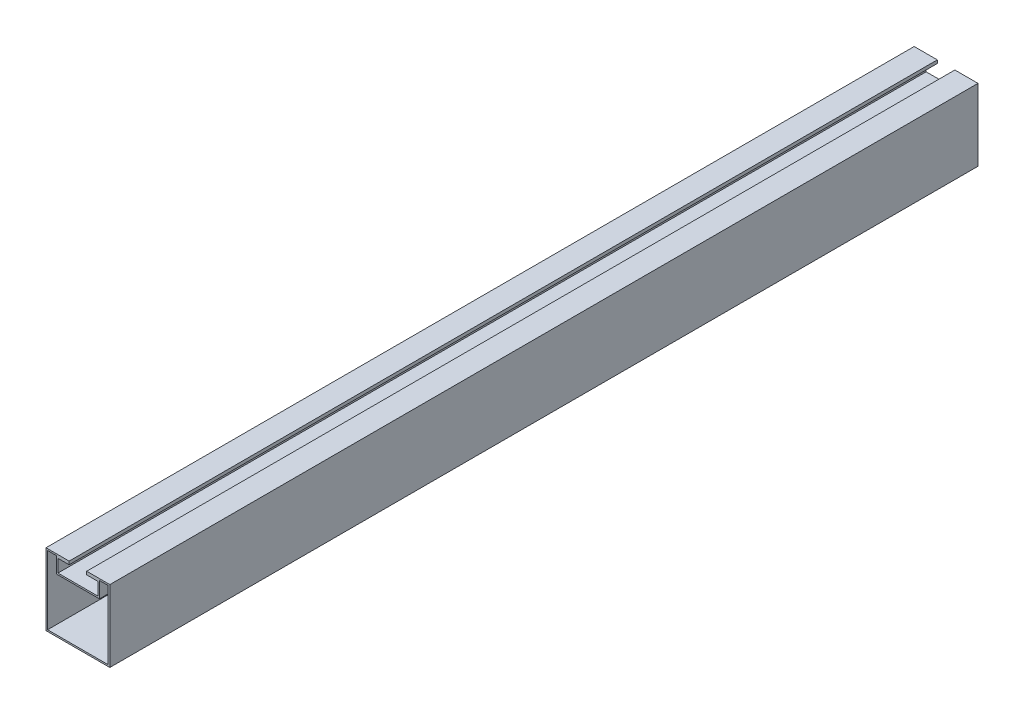
ISO-10303-21;
HEADER;
FILE_DESCRIPTION(('STEP AP214'),'2;1');
FILE_NAME('part.step','',(''),(''),'','','');
FILE_SCHEMA(('AUTOMOTIVE_DESIGN { 1 0 10303 214 1 1 1 1 }'));
ENDSEC;
DATA;
#1=APPLICATION_CONTEXT('core data for automotive mechanical design processes');
#2=APPLICATION_PROTOCOL_DEFINITION('international standard','automotive_design',2000,#1);
#3=PRODUCT_CONTEXT('',#1,'mechanical');
#4=PRODUCT('Part','Part','',(#3));
#5=PRODUCT_RELATED_PRODUCT_CATEGORY('part','',(#4));
#6=PRODUCT_DEFINITION_FORMATION('','',#4);
#7=PRODUCT_DEFINITION_CONTEXT('part definition',#1,'design');
#8=PRODUCT_DEFINITION('design','',#6,#7);
#9=PRODUCT_DEFINITION_SHAPE('','',#8);
#10=(LENGTH_UNIT() NAMED_UNIT(*) SI_UNIT(.MILLI.,.METRE.));
#11=(NAMED_UNIT(*) PLANE_ANGLE_UNIT() SI_UNIT($,.RADIAN.));
#12=(NAMED_UNIT(*) SI_UNIT($,.STERADIAN.) SOLID_ANGLE_UNIT());
#13=UNCERTAINTY_MEASURE_WITH_UNIT(LENGTH_MEASURE(1.E-05),#10,'distance_accuracy_value','');
#14=(GEOMETRIC_REPRESENTATION_CONTEXT(3) GLOBAL_UNCERTAINTY_ASSIGNED_CONTEXT((#13)) GLOBAL_UNIT_ASSIGNED_CONTEXT((#10,
#11,#12)) REPRESENTATION_CONTEXT('',''));
#15=CARTESIAN_POINT('',(0.,0.,0.));
#16=DIRECTION('',(0.,0.,1.));
#17=DIRECTION('',(1.,0.,0.));
#18=AXIS2_PLACEMENT_3D('',#15,#16,#17);
#19=CARTESIAN_POINT('',(25.5,0.,550.));
#20=DIRECTION('',(-1.,0.,0.));
#21=DIRECTION('',(0.,0.,1.));
#22=AXIS2_PLACEMENT_3D('',#19,#20,#21);
#23=PLANE('',#22);
#24=DIRECTION('',(0.,0.,-1.));
#25=VECTOR('',#24,1.);
#26=CARTESIAN_POINT('',(25.5,45.,550.));
#27=LINE('',#26,#25);
#28=CARTESIAN_POINT('',(25.5,45.,550.));
#29=VERTEX_POINT('',#28);
#30=CARTESIAN_POINT('',(25.5,45.,6.00000000000001));
#31=VERTEX_POINT('',#30);
#32=EDGE_CURVE('E189',#29,#31,#27,.T.);
#33=ORIENTED_EDGE('',*,*,#32,.T.);
#34=DIRECTION('',(0.,-1.,0.));
#35=VECTOR('',#34,1.);
#36=CARTESIAN_POINT('',(25.5,0.,6.00000000000001));
#37=LINE('',#36,#35);
#38=CARTESIAN_POINT('',(25.5,43.,6.00000000000001));
#39=VERTEX_POINT('',#38);
#40=EDGE_CURVE('E59',#31,#39,#37,.T.);
#41=ORIENTED_EDGE('',*,*,#40,.T.);
#42=DIRECTION('',(0.,0.,-1.));
#43=VECTOR('',#42,1.);
#44=CARTESIAN_POINT('',(25.5,43.,550.));
#45=LINE('',#44,#43);
#46=CARTESIAN_POINT('',(25.5,43.,550.));
#47=VERTEX_POINT('',#46);
#48=EDGE_CURVE('E44',#47,#39,#45,.T.);
#49=ORIENTED_EDGE('',*,*,#48,.F.);
#50=DIRECTION('',(0.,1.,0.));
#51=VECTOR('',#50,1.);
#52=CARTESIAN_POINT('',(25.5,0.,550.));
#53=LINE('',#52,#51);
#54=EDGE_CURVE('E298',#47,#29,#53,.T.);
#55=ORIENTED_EDGE('',*,*,#54,.T.);
#56=EDGE_LOOP('',(#33,#41,#49,#55));
#57=FACE_BOUND('',#56,.T.);
#58=ADVANCED_FACE('F36',(#57),#23,.T.);
#59=CARTESIAN_POINT('',(0.,43.,550.));
#60=DIRECTION('',(0.,1.,0.));
#61=DIRECTION('',(0.,0.,1.));
#62=AXIS2_PLACEMENT_3D('',#59,#60,#61);
#63=PLANE('',#62);
#64=DIRECTION('',(-1.,0.,0.));
#65=VECTOR('',#64,1.);
#66=CARTESIAN_POINT('',(0.,43.,6.00000000000001));
#67=LINE('',#66,#65);
#68=CARTESIAN_POINT('',(32.5,43.,6.00000000000001));
#69=VERTEX_POINT('',#68);
#70=EDGE_CURVE('E356',#69,#39,#67,.T.);
#71=ORIENTED_EDGE('',*,*,#70,.F.);
#72=DIRECTION('',(0.,0.,-1.));
#73=VECTOR('',#72,1.);
#74=CARTESIAN_POINT('',(32.5,43.,550.));
#75=LINE('',#74,#73);
#76=CARTESIAN_POINT('',(32.5,43.,550.));
#77=VERTEX_POINT('',#76);
#78=EDGE_CURVE('E217',#77,#69,#75,.T.);
#79=ORIENTED_EDGE('',*,*,#78,.F.);
#80=DIRECTION('',(1.,0.,0.));
#81=VECTOR('',#80,1.);
#82=CARTESIAN_POINT('',(0.,43.,550.));
#83=LINE('',#82,#81);
#84=EDGE_CURVE('E301',#47,#77,#83,.T.);
#85=ORIENTED_EDGE('',*,*,#84,.F.);
#86=ORIENTED_EDGE('',*,*,#48,.T.);
#87=EDGE_LOOP('',(#71,#79,#85,#86));
#88=FACE_BOUND('',#87,.T.);
#89=ADVANCED_FACE('F408',(#88),#63,.F.);
#90=CARTESIAN_POINT('',(32.5,0.,550.));
#91=DIRECTION('',(1.,0.,0.));
#92=DIRECTION('',(0.,0.,-1.));
#93=AXIS2_PLACEMENT_3D('',#90,#91,#92);
#94=PLANE('',#93);
#95=DIRECTION('',(0.,1.,0.));
#96=VECTOR('',#95,1.);
#97=CARTESIAN_POINT('',(32.5,0.,6.00000000000001));
#98=LINE('',#97,#96);
#99=CARTESIAN_POINT('',(32.5,35.,6.00000000000001));
#100=VERTEX_POINT('',#99);
#101=EDGE_CURVE('E354',#100,#69,#98,.T.);
#102=ORIENTED_EDGE('',*,*,#101,.F.);
#103=DIRECTION('',(0.,0.,-1.));
#104=VECTOR('',#103,1.);
#105=CARTESIAN_POINT('',(32.5,35.,550.));
#106=LINE('',#105,#104);
#107=CARTESIAN_POINT('',(32.5,35.,550.));
#108=VERTEX_POINT('',#107);
#109=EDGE_CURVE('E214',#108,#100,#106,.T.);
#110=ORIENTED_EDGE('',*,*,#109,.F.);
#111=DIRECTION('',(0.,-1.,0.));
#112=VECTOR('',#111,1.);
#113=CARTESIAN_POINT('',(32.5,0.,550.));
#114=LINE('',#113,#112);
#115=EDGE_CURVE('E304',#77,#108,#114,.T.);
#116=ORIENTED_EDGE('',*,*,#115,.F.);
#117=ORIENTED_EDGE('',*,*,#78,.T.);
#118=EDGE_LOOP('',(#102,#110,#116,#117));
#119=FACE_BOUND('',#118,.T.);
#120=ADVANCED_FACE('F414',(#119),#94,.F.);
#121=CARTESIAN_POINT('',(0.,35.,550.));
#122=DIRECTION('',(0.,1.,0.));
#123=DIRECTION('',(-1.,0.,0.));
#124=AXIS2_PLACEMENT_3D('',#121,#122,#123);
#125=PLANE('',#124);
#126=CARTESIAN_POINT('',(20.,35.,40.));
#127=DIRECTION('',(0.,1.,0.));
#128=DIRECTION('',(-1.,0.,0.));
#129=AXIS2_PLACEMENT_3D('',#126,#127,#128);
#130=CIRCLE('',#129,3.);
#131=CARTESIAN_POINT('',(17.,35.,40.));
#132=VERTEX_POINT('',#131);
#133=EDGE_CURVE('E248',#132,#132,#130,.T.);
#134=ORIENTED_EDGE('',*,*,#133,.F.);
#135=EDGE_LOOP('',(#134));
#136=FACE_BOUND('',#135,.T.);
#137=CARTESIAN_POINT('',(20.,35.,510.));
#138=DIRECTION('',(0.,1.,0.));
#139=DIRECTION('',(-1.,0.,0.));
#140=AXIS2_PLACEMENT_3D('',#137,#138,#139);
#141=CIRCLE('',#140,3.);
#142=CARTESIAN_POINT('',(17.,35.,510.));
#143=VERTEX_POINT('',#142);
#144=EDGE_CURVE('E252',#143,#143,#141,.T.);
#145=ORIENTED_EDGE('',*,*,#144,.F.);
#146=EDGE_LOOP('',(#145));
#147=FACE_BOUND('',#146,.T.);
#148=ORIENTED_EDGE('',*,*,#109,.T.);
#149=DIRECTION('',(-1.,0.,0.));
#150=VECTOR('',#149,1.);
#151=CARTESIAN_POINT('',(0.,35.,6.00000000000001));
#152=LINE('',#151,#150);
#153=CARTESIAN_POINT('',(7.49999999999999,35.,6.00000000000001));
#154=VERTEX_POINT('',#153);
#155=EDGE_CURVE('E351',#100,#154,#152,.T.);
#156=ORIENTED_EDGE('',*,*,#155,.T.);
#157=DIRECTION('',(0.,0.,-1.));
#158=VECTOR('',#157,1.);
#159=CARTESIAN_POINT('',(7.49999999999999,35.,550.));
#160=LINE('',#159,#158);
#161=CARTESIAN_POINT('',(7.49999999999999,35.,550.));
#162=VERTEX_POINT('',#161);
#163=EDGE_CURVE('E211',#162,#154,#160,.T.);
#164=ORIENTED_EDGE('',*,*,#163,.F.);
#165=DIRECTION('',(1.,0.,0.));
#166=VECTOR('',#165,1.);
#167=CARTESIAN_POINT('',(0.,35.,550.));
#168=LINE('',#167,#166);
#169=EDGE_CURVE('E306',#162,#108,#168,.T.);
#170=ORIENTED_EDGE('',*,*,#169,.T.);
#171=EDGE_LOOP('',(#148,#156,#164,#170));
#172=FACE_BOUND('',#171,.T.);
#173=ADVANCED_FACE('F522',(#136,#147,#172),#125,.T.);
#174=CARTESIAN_POINT('',(7.49999999999999,0.,550.));
#175=DIRECTION('',(1.,0.,0.));
#176=DIRECTION('',(0.,0.,-1.));
#177=AXIS2_PLACEMENT_3D('',#174,#175,#176);
#178=PLANE('',#177);
#179=ORIENTED_EDGE('',*,*,#163,.T.);
#180=DIRECTION('',(0.,1.,0.));
#181=VECTOR('',#180,1.);
#182=CARTESIAN_POINT('',(7.49999999999999,0.,6.00000000000001));
#183=LINE('',#182,#181);
#184=CARTESIAN_POINT('',(7.49999999999999,43.,6.00000000000001));
#185=VERTEX_POINT('',#184);
#186=EDGE_CURVE('E348',#154,#185,#183,.T.);
#187=ORIENTED_EDGE('',*,*,#186,.T.);
#188=DIRECTION('',(0.,0.,-1.));
#189=VECTOR('',#188,1.);
#190=CARTESIAN_POINT('',(7.49999999999999,43.,550.));
#191=LINE('',#190,#189);
#192=CARTESIAN_POINT('',(7.49999999999999,43.,550.));
#193=VERTEX_POINT('',#192);
#194=EDGE_CURVE('E208',#193,#185,#191,.T.);
#195=ORIENTED_EDGE('',*,*,#194,.F.);
#196=DIRECTION('',(0.,-1.,0.));
#197=VECTOR('',#196,1.);
#198=CARTESIAN_POINT('',(7.49999999999999,0.,550.));
#199=LINE('',#198,#197);
#200=EDGE_CURVE('E309',#193,#162,#199,.T.);
#201=ORIENTED_EDGE('',*,*,#200,.T.);
#202=EDGE_LOOP('',(#179,#187,#195,#201));
#203=FACE_BOUND('',#202,.T.);
#204=ADVANCED_FACE('F530',(#203),#178,.T.);
#205=CARTESIAN_POINT('',(0.,43.,550.));
#206=DIRECTION('',(0.,-1.,0.));
#207=DIRECTION('',(0.,0.,-1.));
#208=AXIS2_PLACEMENT_3D('',#205,#206,#207);
#209=PLANE('',#208);
#210=ORIENTED_EDGE('',*,*,#194,.T.);
#211=DIRECTION('',(1.,0.,0.));
#212=VECTOR('',#211,1.);
#213=CARTESIAN_POINT('',(0.,43.,6.00000000000001));
#214=LINE('',#213,#212);
#215=CARTESIAN_POINT('',(14.5,43.,6.00000000000001));
#216=VERTEX_POINT('',#215);
#217=EDGE_CURVE('E345',#185,#216,#214,.T.);
#218=ORIENTED_EDGE('',*,*,#217,.T.);
#219=DIRECTION('',(0.,0.,-1.));
#220=VECTOR('',#219,1.);
#221=CARTESIAN_POINT('',(14.5,43.,550.));
#222=LINE('',#221,#220);
#223=CARTESIAN_POINT('',(14.5,43.,550.));
#224=VERTEX_POINT('',#223);
#225=EDGE_CURVE('E205',#224,#216,#222,.T.);
#226=ORIENTED_EDGE('',*,*,#225,.F.);
#227=DIRECTION('',(-1.,0.,0.));
#228=VECTOR('',#227,1.);
#229=CARTESIAN_POINT('',(0.,43.,550.));
#230=LINE('',#229,#228);
#231=EDGE_CURVE('E312',#224,#193,#230,.T.);
#232=ORIENTED_EDGE('',*,*,#231,.T.);
#233=EDGE_LOOP('',(#210,#218,#226,#232));
#234=FACE_BOUND('',#233,.T.);
#235=ADVANCED_FACE('F539',(#234),#209,.T.);
#236=CARTESIAN_POINT('',(14.5,0.,550.));
#237=DIRECTION('',(-1.,0.,0.));
#238=DIRECTION('',(0.,-1.,0.));
#239=AXIS2_PLACEMENT_3D('',#236,#237,#238);
#240=PLANE('',#239);
#241=DIRECTION('',(0.,-1.,0.));
#242=VECTOR('',#241,1.);
#243=CARTESIAN_POINT('',(14.5,0.,6.00000000000001));
#244=LINE('',#243,#242);
#245=CARTESIAN_POINT('',(14.5,45.,6.00000000000001));
#246=VERTEX_POINT('',#245);
#247=EDGE_CURVE('E343',#246,#216,#244,.T.);
#248=ORIENTED_EDGE('',*,*,#247,.F.);
#249=DIRECTION('',(0.,0.,-1.));
#250=VECTOR('',#249,1.);
#251=CARTESIAN_POINT('',(14.5,45.,550.));
#252=LINE('',#251,#250);
#253=CARTESIAN_POINT('',(14.5,45.,550.));
#254=VERTEX_POINT('',#253);
#255=EDGE_CURVE('E202',#254,#246,#252,.T.);
#256=ORIENTED_EDGE('',*,*,#255,.F.);
#257=DIRECTION('',(0.,1.,0.));
#258=VECTOR('',#257,1.);
#259=CARTESIAN_POINT('',(14.5,0.,550.));
#260=LINE('',#259,#258);
#261=EDGE_CURVE('E315',#224,#254,#260,.T.);
#262=ORIENTED_EDGE('',*,*,#261,.F.);
#263=ORIENTED_EDGE('',*,*,#225,.T.);
#264=EDGE_LOOP('',(#248,#256,#262,#263));
#265=FACE_BOUND('',#264,.T.);
#266=ADVANCED_FACE('F548',(#265),#240,.F.);
#267=CARTESIAN_POINT('',(0.,45.,550.));
#268=DIRECTION('',(0.,1.,0.));
#269=DIRECTION('',(0.,0.,1.));
#270=AXIS2_PLACEMENT_3D('',#267,#268,#269);
#271=PLANE('',#270);
#272=ORIENTED_EDGE('',*,*,#255,.T.);
#273=DIRECTION('',(-1.,0.,0.));
#274=VECTOR('',#273,1.);
#275=CARTESIAN_POINT('',(0.,45.,6.00000000000001));
#276=LINE('',#275,#274);
#277=CARTESIAN_POINT('',(0.,45.,6.00000000000001));
#278=VERTEX_POINT('',#277);
#279=EDGE_CURVE('E338',#246,#278,#276,.T.);
#280=ORIENTED_EDGE('',*,*,#279,.T.);
#281=DIRECTION('',(0.,0.,-1.));
#282=VECTOR('',#281,1.);
#283=CARTESIAN_POINT('',(0.,45.,550.));
#284=LINE('',#283,#282);
#285=CARTESIAN_POINT('',(0.,45.,550.));
#286=VERTEX_POINT('',#285);
#287=EDGE_CURVE('E199',#286,#278,#284,.T.);
#288=ORIENTED_EDGE('',*,*,#287,.F.);
#289=DIRECTION('',(1.,0.,0.));
#290=VECTOR('',#289,1.);
#291=CARTESIAN_POINT('',(0.,45.,550.));
#292=LINE('',#291,#290);
#293=EDGE_CURVE('E317',#286,#254,#292,.T.);
#294=ORIENTED_EDGE('',*,*,#293,.T.);
#295=EDGE_LOOP('',(#272,#280,#288,#294));
#296=FACE_BOUND('',#295,.T.);
#297=ADVANCED_FACE('F560',(#296),#271,.T.);
#298=CARTESIAN_POINT('',(0.,0.,550.));
#299=DIRECTION('',(-1.,0.,0.));
#300=DIRECTION('',(0.,0.,1.));
#301=AXIS2_PLACEMENT_3D('',#298,#299,#300);
#302=PLANE('',#301);
#303=ORIENTED_EDGE('',*,*,#287,.T.);
#304=DIRECTION('',(0.,-1.,0.));
#305=VECTOR('',#304,1.);
#306=CARTESIAN_POINT('',(0.,0.,6.00000000000001));
#307=LINE('',#306,#305);
#308=CARTESIAN_POINT('',(0.,0.,6.00000000000001));
#309=VERTEX_POINT('',#308);
#310=EDGE_CURVE('E336',#278,#309,#307,.T.);
#311=ORIENTED_EDGE('',*,*,#310,.T.);
#312=DIRECTION('',(0.,0.,-1.));
#313=VECTOR('',#312,1.);
#314=CARTESIAN_POINT('',(0.,0.,550.));
#315=LINE('',#314,#313);
#316=CARTESIAN_POINT('',(0.,0.,550.));
#317=VERTEX_POINT('',#316);
#318=EDGE_CURVE('E191',#317,#309,#315,.T.);
#319=ORIENTED_EDGE('',*,*,#318,.F.);
#320=DIRECTION('',(0.,1.,0.));
#321=VECTOR('',#320,1.);
#322=CARTESIAN_POINT('',(0.,0.,550.));
#323=LINE('',#322,#321);
#324=EDGE_CURVE('E320',#317,#286,#323,.T.);
#325=ORIENTED_EDGE('',*,*,#324,.T.);
#326=EDGE_LOOP('',(#303,#311,#319,#325));
#327=FACE_BOUND('',#326,.T.);
#328=ADVANCED_FACE('F570',(#327),#302,.T.);
#329=CARTESIAN_POINT('',(0.,0.,550.));
#330=DIRECTION('',(0.,1.,0.));
#331=DIRECTION('',(0.,0.,1.));
#332=AXIS2_PLACEMENT_3D('',#329,#330,#331);
#333=PLANE('',#332);
#334=CARTESIAN_POINT('',(20.,0.,40.));
#335=DIRECTION('',(0.,1.,0.));
#336=DIRECTION('',(0.,0.,1.));
#337=AXIS2_PLACEMENT_3D('',#334,#335,#336);
#338=CIRCLE('',#337,3.);
#339=CARTESIAN_POINT('',(20.,0.,43.));
#340=VERTEX_POINT('',#339);
#341=EDGE_CURVE('E272',#340,#340,#338,.T.);
#342=ORIENTED_EDGE('',*,*,#341,.T.);
#343=EDGE_LOOP('',(#342));
#344=FACE_BOUND('',#343,.T.);
#345=CARTESIAN_POINT('',(20.,0.,510.));
#346=DIRECTION('',(0.,1.,0.));
#347=DIRECTION('',(0.,0.,1.));
#348=AXIS2_PLACEMENT_3D('',#345,#346,#347);
#349=CIRCLE('',#348,3.);
#350=CARTESIAN_POINT('',(20.,0.,513.));
#351=VERTEX_POINT('',#350);
#352=EDGE_CURVE('E256',#351,#351,#349,.T.);
#353=ORIENTED_EDGE('',*,*,#352,.T.);
#354=EDGE_LOOP('',(#353));
#355=FACE_BOUND('',#354,.T.);
#356=DIRECTION('',(-1.,0.,0.));
#357=VECTOR('',#356,1.);
#358=CARTESIAN_POINT('',(0.,0.,6.00000000000001));
#359=LINE('',#358,#357);
#360=CARTESIAN_POINT('',(40.,0.,6.00000000000001));
#361=VERTEX_POINT('',#360);
#362=EDGE_CURVE('E184',#361,#309,#359,.T.);
#363=ORIENTED_EDGE('',*,*,#362,.F.);
#364=DIRECTION('',(0.,0.,-1.));
#365=VECTOR('',#364,1.);
#366=CARTESIAN_POINT('',(40.,0.,550.));
#367=LINE('',#366,#365);
#368=CARTESIAN_POINT('',(40.,0.,550.));
#369=VERTEX_POINT('',#368);
#370=EDGE_CURVE('E183',#369,#361,#367,.T.);
#371=ORIENTED_EDGE('',*,*,#370,.F.);
#372=DIRECTION('',(1.,0.,0.));
#373=VECTOR('',#372,1.);
#374=CARTESIAN_POINT('',(0.,0.,550.));
#375=LINE('',#374,#373);
#376=EDGE_CURVE('E323',#317,#369,#375,.T.);
#377=ORIENTED_EDGE('',*,*,#376,.F.);
#378=ORIENTED_EDGE('',*,*,#318,.T.);
#379=EDGE_LOOP('',(#363,#371,#377,#378));
#380=FACE_BOUND('',#379,.T.);
#381=ADVANCED_FACE('F334',(#344,#355,#380),#333,.F.);
#382=CARTESIAN_POINT('',(40.,0.,550.));
#383=DIRECTION('',(-1.,0.,0.));
#384=DIRECTION('',(0.,0.,1.));
#385=AXIS2_PLACEMENT_3D('',#382,#383,#384);
#386=PLANE('',#385);
#387=DIRECTION('',(0.,-1.,0.));
#388=VECTOR('',#387,1.);
#389=CARTESIAN_POINT('',(40.,0.,6.00000000000001));
#390=LINE('',#389,#388);
#391=CARTESIAN_POINT('',(40.,45.,6.00000000000001));
#392=VERTEX_POINT('',#391);
#393=EDGE_CURVE('E171',#392,#361,#390,.T.);
#394=ORIENTED_EDGE('',*,*,#393,.F.);
#395=DIRECTION('',(0.,0.,-1.));
#396=VECTOR('',#395,1.);
#397=CARTESIAN_POINT('',(40.,45.,550.));
#398=LINE('',#397,#396);
#399=CARTESIAN_POINT('',(40.,45.,550.));
#400=VERTEX_POINT('',#399);
#401=EDGE_CURVE('E180',#400,#392,#398,.T.);
#402=ORIENTED_EDGE('',*,*,#401,.F.);
#403=DIRECTION('',(0.,1.,0.));
#404=VECTOR('',#403,1.);
#405=CARTESIAN_POINT('',(40.,0.,550.));
#406=LINE('',#405,#404);
#407=EDGE_CURVE('E326',#369,#400,#406,.T.);
#408=ORIENTED_EDGE('',*,*,#407,.F.);
#409=ORIENTED_EDGE('',*,*,#370,.T.);
#410=EDGE_LOOP('',(#394,#402,#408,#409));
#411=FACE_BOUND('',#410,.T.);
#412=ADVANCED_FACE('F179',(#411),#386,.F.);
#413=CARTESIAN_POINT('',(33.5,0.,550.));
#414=DIRECTION('',(1.,0.,0.));
#415=DIRECTION('',(0.,0.,-1.));
#416=AXIS2_PLACEMENT_3D('',#413,#414,#415);
#417=PLANE('',#416);
#418=DIRECTION('',(0.,0.,-1.));
#419=VECTOR('',#418,1.);
#420=CARTESIAN_POINT('',(33.5,34.,550.));
#421=LINE('',#420,#419);
#422=CARTESIAN_POINT('',(33.5,34.,550.));
#423=VERTEX_POINT('',#422);
#424=CARTESIAN_POINT('',(33.5,34.,6.00000000000001));
#425=VERTEX_POINT('',#424);
#426=EDGE_CURVE('E222',#423,#425,#421,.T.);
#427=ORIENTED_EDGE('',*,*,#426,.T.);
#428=DIRECTION('',(0.,1.,0.));
#429=VECTOR('',#428,1.);
#430=CARTESIAN_POINT('',(33.5,0.,6.00000000000001));
#431=LINE('',#430,#429);
#432=CARTESIAN_POINT('',(33.5,44.,6.00000000000001));
#433=VERTEX_POINT('',#432);
#434=EDGE_CURVE('E51',#425,#433,#431,.T.);
#435=ORIENTED_EDGE('',*,*,#434,.T.);
#436=DIRECTION('',(0.,0.,-1.));
#437=VECTOR('',#436,1.);
#438=CARTESIAN_POINT('',(33.5,44.,550.));
#439=LINE('',#438,#437);
#440=CARTESIAN_POINT('',(33.5,44.,550.));
#441=VERTEX_POINT('',#440);
#442=EDGE_CURVE('E193',#441,#433,#439,.T.);
#443=ORIENTED_EDGE('',*,*,#442,.F.);
#444=DIRECTION('',(0.,-1.,0.));
#445=VECTOR('',#444,1.);
#446=CARTESIAN_POINT('',(33.5,0.,550.));
#447=LINE('',#446,#445);
#448=EDGE_CURVE('E275',#441,#423,#447,.T.);
#449=ORIENTED_EDGE('',*,*,#448,.T.);
#450=EDGE_LOOP('',(#427,#435,#443,#449));
#451=FACE_BOUND('',#450,.T.);
#452=ADVANCED_FACE('F38',(#451),#417,.T.);
#453=CARTESIAN_POINT('',(0.,44.,550.));
#454=DIRECTION('',(0.,-1.,0.));
#455=DIRECTION('',(1.,0.,0.));
#456=AXIS2_PLACEMENT_3D('',#453,#454,#455);
#457=PLANE('',#456);
#458=ORIENTED_EDGE('',*,*,#442,.T.);
#459=DIRECTION('',(1.,0.,0.));
#460=VECTOR('',#459,1.);
#461=CARTESIAN_POINT('',(0.,44.,6.00000000000001));
#462=LINE('',#461,#460);
#463=CARTESIAN_POINT('',(39.,44.,6.00000000000001));
#464=VERTEX_POINT('',#463);
#465=EDGE_CURVE('E262',#433,#464,#462,.T.);
#466=ORIENTED_EDGE('',*,*,#465,.T.);
#467=DIRECTION('',(0.,0.,-1.));
#468=VECTOR('',#467,1.);
#469=CARTESIAN_POINT('',(39.,44.,550.));
#470=LINE('',#469,#468);
#471=CARTESIAN_POINT('',(39.,44.,550.));
#472=VERTEX_POINT('',#471);
#473=EDGE_CURVE('E240',#472,#464,#470,.T.);
#474=ORIENTED_EDGE('',*,*,#473,.F.);
#475=DIRECTION('',(-1.,0.,0.));
#476=VECTOR('',#475,1.);
#477=CARTESIAN_POINT('',(0.,44.,550.));
#478=LINE('',#477,#476);
#479=EDGE_CURVE('E278',#472,#441,#478,.T.);
#480=ORIENTED_EDGE('',*,*,#479,.T.);
#481=EDGE_LOOP('',(#458,#466,#474,#480));
#482=FACE_BOUND('',#481,.T.);
#483=ADVANCED_FACE('F377',(#482),#457,.T.);
#484=CARTESIAN_POINT('',(39.,0.,550.));
#485=DIRECTION('',(-1.,0.,0.));
#486=DIRECTION('',(0.,-1.,0.));
#487=AXIS2_PLACEMENT_3D('',#484,#485,#486);
#488=PLANE('',#487);
#489=ORIENTED_EDGE('',*,*,#473,.T.);
#490=DIRECTION('',(0.,-1.,0.));
#491=VECTOR('',#490,1.);
#492=CARTESIAN_POINT('',(39.,0.,6.00000000000001));
#493=LINE('',#492,#491);
#494=CARTESIAN_POINT('',(39.,1.,6.00000000000001));
#495=VERTEX_POINT('',#494);
#496=EDGE_CURVE('E373',#464,#495,#493,.T.);
#497=ORIENTED_EDGE('',*,*,#496,.T.);
#498=DIRECTION('',(0.,0.,-1.));
#499=VECTOR('',#498,1.);
#500=CARTESIAN_POINT('',(39.,1.,550.));
#501=LINE('',#500,#499);
#502=CARTESIAN_POINT('',(39.,1.,550.));
#503=VERTEX_POINT('',#502);
#504=EDGE_CURVE('E237',#503,#495,#501,.T.);
#505=ORIENTED_EDGE('',*,*,#504,.F.);
#506=DIRECTION('',(0.,1.,0.));
#507=VECTOR('',#506,1.);
#508=CARTESIAN_POINT('',(39.,0.,550.));
#509=LINE('',#508,#507);
#510=EDGE_CURVE('E281',#503,#472,#509,.T.);
#511=ORIENTED_EDGE('',*,*,#510,.T.);
#512=EDGE_LOOP('',(#489,#497,#505,#511));
#513=FACE_BOUND('',#512,.T.);
#514=ADVANCED_FACE('F380',(#513),#488,.T.);
#515=CARTESIAN_POINT('',(0.,1.,550.));
#516=DIRECTION('',(0.,1.,0.));
#517=DIRECTION('',(-1.,0.,0.));
#518=AXIS2_PLACEMENT_3D('',#515,#516,#517);
#519=PLANE('',#518);
#520=CARTESIAN_POINT('',(20.,1.,40.));
#521=DIRECTION('',(0.,1.,0.));
#522=DIRECTION('',(-1.,0.,0.));
#523=AXIS2_PLACEMENT_3D('',#520,#521,#522);
#524=CIRCLE('',#523,3.);
#525=CARTESIAN_POINT('',(17.,1.,40.));
#526=VERTEX_POINT('',#525);
#527=EDGE_CURVE('E247',#526,#526,#524,.T.);
#528=ORIENTED_EDGE('',*,*,#527,.F.);
#529=EDGE_LOOP('',(#528));
#530=FACE_BOUND('',#529,.T.);
#531=CARTESIAN_POINT('',(20.,1.,510.));
#532=DIRECTION('',(0.,1.,0.));
#533=DIRECTION('',(-1.,0.,0.));
#534=AXIS2_PLACEMENT_3D('',#531,#532,#533);
#535=CIRCLE('',#534,3.);
#536=CARTESIAN_POINT('',(17.,1.,510.));
#537=VERTEX_POINT('',#536);
#538=EDGE_CURVE('E251',#537,#537,#535,.T.);
#539=ORIENTED_EDGE('',*,*,#538,.F.);
#540=EDGE_LOOP('',(#539));
#541=FACE_BOUND('',#540,.T.);
#542=ORIENTED_EDGE('',*,*,#504,.T.);
#543=DIRECTION('',(-1.,0.,0.));
#544=VECTOR('',#543,1.);
#545=CARTESIAN_POINT('',(0.,1.,6.00000000000001));
#546=LINE('',#545,#544);
#547=CARTESIAN_POINT('',(1.,1.,6.00000000000001));
#548=VERTEX_POINT('',#547);
#549=EDGE_CURVE('E370',#495,#548,#546,.T.);
#550=ORIENTED_EDGE('',*,*,#549,.T.);
#551=DIRECTION('',(0.,0.,-1.));
#552=VECTOR('',#551,1.);
#553=CARTESIAN_POINT('',(1.,1.,550.));
#554=LINE('',#553,#552);
#555=CARTESIAN_POINT('',(1.,1.,550.));
#556=VERTEX_POINT('',#555);
#557=EDGE_CURVE('E234',#556,#548,#554,.T.);
#558=ORIENTED_EDGE('',*,*,#557,.F.);
#559=DIRECTION('',(1.,0.,0.));
#560=VECTOR('',#559,1.);
#561=CARTESIAN_POINT('',(0.,1.,550.));
#562=LINE('',#561,#560);
#563=EDGE_CURVE('E284',#556,#503,#562,.T.);
#564=ORIENTED_EDGE('',*,*,#563,.T.);
#565=EDGE_LOOP('',(#542,#550,#558,#564));
#566=FACE_BOUND('',#565,.T.);
#567=ADVANCED_FACE('F387',(#530,#541,#566),#519,.T.);
#568=CARTESIAN_POINT('',(1.,0.,550.));
#569=DIRECTION('',(1.,0.,0.));
#570=DIRECTION('',(0.,0.,-1.));
#571=AXIS2_PLACEMENT_3D('',#568,#569,#570);
#572=PLANE('',#571);
#573=ORIENTED_EDGE('',*,*,#557,.T.);
#574=DIRECTION('',(0.,1.,0.));
#575=VECTOR('',#574,1.);
#576=CARTESIAN_POINT('',(1.,0.,6.00000000000001));
#577=LINE('',#576,#575);
#578=CARTESIAN_POINT('',(1.,44.,6.00000000000001));
#579=VERTEX_POINT('',#578);
#580=EDGE_CURVE('E367',#548,#579,#577,.T.);
#581=ORIENTED_EDGE('',*,*,#580,.T.);
#582=DIRECTION('',(0.,0.,-1.));
#583=VECTOR('',#582,1.);
#584=CARTESIAN_POINT('',(1.,44.,550.));
#585=LINE('',#584,#583);
#586=CARTESIAN_POINT('',(1.,44.,550.));
#587=VERTEX_POINT('',#586);
#588=EDGE_CURVE('E231',#587,#579,#585,.T.);
#589=ORIENTED_EDGE('',*,*,#588,.F.);
#590=DIRECTION('',(0.,-1.,0.));
#591=VECTOR('',#590,1.);
#592=CARTESIAN_POINT('',(1.,0.,550.));
#593=LINE('',#592,#591);
#594=EDGE_CURVE('E287',#587,#556,#593,.T.);
#595=ORIENTED_EDGE('',*,*,#594,.T.);
#596=EDGE_LOOP('',(#573,#581,#589,#595));
#597=FACE_BOUND('',#596,.T.);
#598=ADVANCED_FACE('F389',(#597),#572,.T.);
#599=CARTESIAN_POINT('',(0.,44.,550.));
#600=DIRECTION('',(0.,-1.,0.));
#601=DIRECTION('',(0.,0.,-1.));
#602=AXIS2_PLACEMENT_3D('',#599,#600,#601);
#603=PLANE('',#602);
#604=ORIENTED_EDGE('',*,*,#588,.T.);
#605=DIRECTION('',(1.,0.,0.));
#606=VECTOR('',#605,1.);
#607=CARTESIAN_POINT('',(0.,44.,6.00000000000001));
#608=LINE('',#607,#606);
#609=CARTESIAN_POINT('',(6.49999999999999,44.,6.00000000000001));
#610=VERTEX_POINT('',#609);
#611=EDGE_CURVE('E364',#579,#610,#608,.T.);
#612=ORIENTED_EDGE('',*,*,#611,.T.);
#613=DIRECTION('',(0.,0.,-1.));
#614=VECTOR('',#613,1.);
#615=CARTESIAN_POINT('',(6.49999999999999,44.,550.));
#616=LINE('',#615,#614);
#617=CARTESIAN_POINT('',(6.49999999999999,44.,550.));
#618=VERTEX_POINT('',#617);
#619=EDGE_CURVE('E228',#618,#610,#616,.T.);
#620=ORIENTED_EDGE('',*,*,#619,.F.);
#621=DIRECTION('',(-1.,0.,0.));
#622=VECTOR('',#621,1.);
#623=CARTESIAN_POINT('',(0.,44.,550.));
#624=LINE('',#623,#622);
#625=EDGE_CURVE('E290',#618,#587,#624,.T.);
#626=ORIENTED_EDGE('',*,*,#625,.T.);
#627=EDGE_LOOP('',(#604,#612,#620,#626));
#628=FACE_BOUND('',#627,.T.);
#629=ADVANCED_FACE('F393',(#628),#603,.T.);
#630=CARTESIAN_POINT('',(6.5,0.,550.));
#631=DIRECTION('',(-1.,0.,0.));
#632=DIRECTION('',(0.,-1.,0.));
#633=AXIS2_PLACEMENT_3D('',#630,#631,#632);
#634=PLANE('',#633);
#635=ORIENTED_EDGE('',*,*,#619,.T.);
#636=DIRECTION('',(0.,-1.,0.));
#637=VECTOR('',#636,1.);
#638=CARTESIAN_POINT('',(6.5,0.,6.00000000000001));
#639=LINE('',#638,#637);
#640=CARTESIAN_POINT('',(6.5,34.,6.00000000000001));
#641=VERTEX_POINT('',#640);
#642=EDGE_CURVE('E361',#610,#641,#639,.T.);
#643=ORIENTED_EDGE('',*,*,#642,.T.);
#644=DIRECTION('',(0.,0.,-1.));
#645=VECTOR('',#644,1.);
#646=CARTESIAN_POINT('',(6.5,34.,550.));
#647=LINE('',#646,#645);
#648=CARTESIAN_POINT('',(6.5,34.,550.));
#649=VERTEX_POINT('',#648);
#650=EDGE_CURVE('E225',#649,#641,#647,.T.);
#651=ORIENTED_EDGE('',*,*,#650,.F.);
#652=DIRECTION('',(0.,1.,0.));
#653=VECTOR('',#652,1.);
#654=CARTESIAN_POINT('',(6.5,0.,550.));
#655=LINE('',#654,#653);
#656=EDGE_CURVE('E293',#649,#618,#655,.T.);
#657=ORIENTED_EDGE('',*,*,#656,.T.);
#658=EDGE_LOOP('',(#635,#643,#651,#657));
#659=FACE_BOUND('',#658,.T.);
#660=ADVANCED_FACE('F395',(#659),#634,.T.);
#661=CARTESIAN_POINT('',(0.,34.,550.));
#662=DIRECTION('',(0.,1.,0.));
#663=DIRECTION('',(-1.,0.,0.));
#664=AXIS2_PLACEMENT_3D('',#661,#662,#663);
#665=PLANE('',#664);
#666=CARTESIAN_POINT('',(20.,34.,40.));
#667=DIRECTION('',(0.,1.,0.));
#668=DIRECTION('',(-1.,0.,0.));
#669=AXIS2_PLACEMENT_3D('',#666,#667,#668);
#670=CIRCLE('',#669,3.);
#671=CARTESIAN_POINT('',(17.,34.,40.));
#672=VERTEX_POINT('',#671);
#673=EDGE_CURVE('E245',#672,#672,#670,.T.);
#674=ORIENTED_EDGE('',*,*,#673,.T.);
#675=EDGE_LOOP('',(#674));
#676=FACE_BOUND('',#675,.T.);
#677=CARTESIAN_POINT('',(20.,34.,510.));
#678=DIRECTION('',(0.,1.,0.));
#679=DIRECTION('',(-1.,0.,0.));
#680=AXIS2_PLACEMENT_3D('',#677,#678,#679);
#681=CIRCLE('',#680,3.);
#682=CARTESIAN_POINT('',(17.,34.,510.));
#683=VERTEX_POINT('',#682);
#684=EDGE_CURVE('E249',#683,#683,#681,.T.);
#685=ORIENTED_EDGE('',*,*,#684,.T.);
#686=EDGE_LOOP('',(#685));
#687=FACE_BOUND('',#686,.T.);
#688=DIRECTION('',(-1.,0.,0.));
#689=VECTOR('',#688,1.);
#690=CARTESIAN_POINT('',(0.,34.,6.00000000000001));
#691=LINE('',#690,#689);
#692=EDGE_CURVE('E359',#425,#641,#691,.T.);
#693=ORIENTED_EDGE('',*,*,#692,.F.);
#694=ORIENTED_EDGE('',*,*,#426,.F.);
#695=DIRECTION('',(1.,0.,0.));
#696=VECTOR('',#695,1.);
#697=CARTESIAN_POINT('',(0.,34.,550.));
#698=LINE('',#697,#696);
#699=EDGE_CURVE('E296',#649,#423,#698,.T.);
#700=ORIENTED_EDGE('',*,*,#699,.F.);
#701=ORIENTED_EDGE('',*,*,#650,.T.);
#702=EDGE_LOOP('',(#693,#694,#700,#701));
#703=FACE_BOUND('',#702,.T.);
#704=ADVANCED_FACE('F399',(#676,#687,#703),#665,.F.);
#705=CARTESIAN_POINT('',(0.,45.,550.));
#706=DIRECTION('',(0.,1.,0.));
#707=DIRECTION('',(0.,0.,1.));
#708=AXIS2_PLACEMENT_3D('',#705,#706,#707);
#709=PLANE('',#708);
#710=ORIENTED_EDGE('',*,*,#401,.T.);
#711=DIRECTION('',(-1.,0.,0.));
#712=VECTOR('',#711,1.);
#713=CARTESIAN_POINT('',(0.,45.,6.00000000000001));
#714=LINE('',#713,#712);
#715=EDGE_CURVE('E11',#392,#31,#714,.T.);
#716=ORIENTED_EDGE('',*,*,#715,.T.);
#717=ORIENTED_EDGE('',*,*,#32,.F.);
#718=DIRECTION('',(1.,0.,0.));
#719=VECTOR('',#718,1.);
#720=CARTESIAN_POINT('',(0.,45.,550.));
#721=LINE('',#720,#719);
#722=EDGE_CURVE('E188',#29,#400,#721,.T.);
#723=ORIENTED_EDGE('',*,*,#722,.T.);
#724=EDGE_LOOP('',(#710,#716,#717,#723));
#725=FACE_BOUND('',#724,.T.);
#726=ADVANCED_FACE('F186',(#725),#709,.T.);
#727=CARTESIAN_POINT('',(0.,0.,550.));
#728=DIRECTION('',(0.,0.,1.));
#729=DIRECTION('',(1.,0.,0.));
#730=AXIS2_PLACEMENT_3D('',#727,#728,#729);
#731=PLANE('',#730);
#732=ORIENTED_EDGE('',*,*,#448,.F.);
#733=ORIENTED_EDGE('',*,*,#479,.F.);
#734=ORIENTED_EDGE('',*,*,#510,.F.);
#735=ORIENTED_EDGE('',*,*,#563,.F.);
#736=ORIENTED_EDGE('',*,*,#594,.F.);
#737=ORIENTED_EDGE('',*,*,#625,.F.);
#738=ORIENTED_EDGE('',*,*,#656,.F.);
#739=ORIENTED_EDGE('',*,*,#699,.T.);
#740=EDGE_LOOP('',(#732,#733,#734,#735,#736,#737,#738,#739));
#741=FACE_BOUND('',#740,.T.);
#742=ORIENTED_EDGE('',*,*,#54,.F.);
#743=ORIENTED_EDGE('',*,*,#84,.T.);
#744=ORIENTED_EDGE('',*,*,#115,.T.);
#745=ORIENTED_EDGE('',*,*,#169,.F.);
#746=ORIENTED_EDGE('',*,*,#200,.F.);
#747=ORIENTED_EDGE('',*,*,#231,.F.);
#748=ORIENTED_EDGE('',*,*,#261,.T.);
#749=ORIENTED_EDGE('',*,*,#293,.F.);
#750=ORIENTED_EDGE('',*,*,#324,.F.);
#751=ORIENTED_EDGE('',*,*,#376,.T.);
#752=ORIENTED_EDGE('',*,*,#407,.T.);
#753=ORIENTED_EDGE('',*,*,#722,.F.);
#754=EDGE_LOOP('',(#742,#743,#744,#745,#746,#747,#748,#749,#750,#751,#752,#753));
#755=FACE_BOUND('',#754,.T.);
#756=ADVANCED_FACE('F329',(#741,#755),#731,.T.);
#757=CARTESIAN_POINT('',(19.9999999999999,-165.,40.));
#758=DIRECTION('',(0.,1.,0.));
#759=DIRECTION('',(-1.,0.,0.));
#760=AXIS2_PLACEMENT_3D('',#757,#758,#759);
#761=CYLINDRICAL_SURFACE('',#760,3.);
#762=ORIENTED_EDGE('',*,*,#133,.T.);
#763=EDGE_LOOP('',(#762));
#764=FACE_BOUND('',#763,.T.);
#765=ORIENTED_EDGE('',*,*,#673,.F.);
#766=EDGE_LOOP('',(#765));
#767=FACE_BOUND('',#766,.T.);
#768=ADVANCED_FACE('F469',(#764,#767),#761,.F.);
#769=ORIENTED_EDGE('',*,*,#527,.T.);
#770=EDGE_LOOP('',(#769));
#771=FACE_BOUND('',#770,.T.);
#772=ORIENTED_EDGE('',*,*,#341,.F.);
#773=EDGE_LOOP('',(#772));
#774=FACE_BOUND('',#773,.T.);
#775=ADVANCED_FACE('F476',(#771,#774),#761,.F.);
#776=CARTESIAN_POINT('',(19.9999999999999,-165.,510.));
#777=DIRECTION('',(0.,1.,0.));
#778=DIRECTION('',(-1.,0.,0.));
#779=AXIS2_PLACEMENT_3D('',#776,#777,#778);
#780=CYLINDRICAL_SURFACE('',#779,3.);
#781=ORIENTED_EDGE('',*,*,#144,.T.);
#782=EDGE_LOOP('',(#781));
#783=FACE_BOUND('',#782,.T.);
#784=ORIENTED_EDGE('',*,*,#684,.F.);
#785=EDGE_LOOP('',(#784));
#786=FACE_BOUND('',#785,.T.);
#787=ADVANCED_FACE('F484',(#783,#786),#780,.F.);
#788=ORIENTED_EDGE('',*,*,#538,.T.);
#789=EDGE_LOOP('',(#788));
#790=FACE_BOUND('',#789,.T.);
#791=ORIENTED_EDGE('',*,*,#352,.F.);
#792=EDGE_LOOP('',(#791));
#793=FACE_BOUND('',#792,.T.);
#794=ADVANCED_FACE('F491',(#790,#793),#780,.F.);
#795=CARTESIAN_POINT('',(0.,0.,6.));
#796=DIRECTION('',(0.,0.,-1.));
#797=DIRECTION('',(-1.,0.,0.));
#798=AXIS2_PLACEMENT_3D('',#795,#796,#797);
#799=PLANE('',#798);
#800=ORIENTED_EDGE('',*,*,#692,.T.);
#801=ORIENTED_EDGE('',*,*,#642,.F.);
#802=ORIENTED_EDGE('',*,*,#611,.F.);
#803=ORIENTED_EDGE('',*,*,#580,.F.);
#804=ORIENTED_EDGE('',*,*,#549,.F.);
#805=ORIENTED_EDGE('',*,*,#496,.F.);
#806=ORIENTED_EDGE('',*,*,#465,.F.);
#807=ORIENTED_EDGE('',*,*,#434,.F.);
#808=EDGE_LOOP('',(#800,#801,#802,#803,#804,#805,#806,#807));
#809=FACE_BOUND('',#808,.T.);
#810=ORIENTED_EDGE('',*,*,#715,.F.);
#811=ORIENTED_EDGE('',*,*,#393,.T.);
#812=ORIENTED_EDGE('',*,*,#362,.T.);
#813=ORIENTED_EDGE('',*,*,#310,.F.);
#814=ORIENTED_EDGE('',*,*,#279,.F.);
#815=ORIENTED_EDGE('',*,*,#247,.T.);
#816=ORIENTED_EDGE('',*,*,#217,.F.);
#817=ORIENTED_EDGE('',*,*,#186,.F.);
#818=ORIENTED_EDGE('',*,*,#155,.F.);
#819=ORIENTED_EDGE('',*,*,#101,.T.);
#820=ORIENTED_EDGE('',*,*,#70,.T.);
#821=ORIENTED_EDGE('',*,*,#40,.F.);
#822=EDGE_LOOP('',(#810,#811,#812,#813,#814,#815,#816,#817,#818,#819,#820,#821));
#823=FACE_BOUND('',#822,.T.);
#824=ADVANCED_FACE('F170',(#809,#823),#799,.T.);
#825=CLOSED_SHELL('',(#58,#89,#120,#173,#204,#235,#266,#297,#328,#381,#412,#452,#483,#514,#567,
#598,#629,#660,#704,#726,#756,#768,#775,#787,#794,#824));
#826=MANIFOLD_SOLID_BREP('B2',#825);
#827=ADVANCED_BREP_SHAPE_REPRESENTATION('',(#18,#826),#14);
#828=SHAPE_DEFINITION_REPRESENTATION(#9,#827);
ENDSEC;
END-ISO-10303-21;
